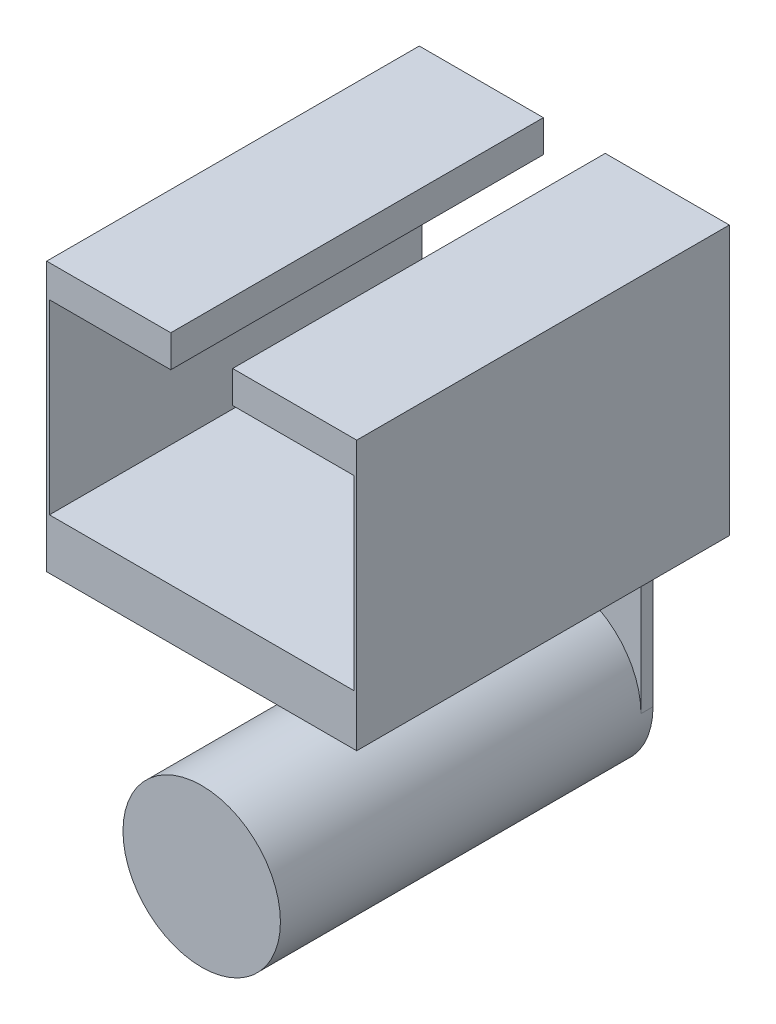
ISO-10303-21;
HEADER;
FILE_DESCRIPTION(('STEP AP214'),'2;1');
FILE_NAME('part.step','',(''),(''),'','','');
FILE_SCHEMA(('AUTOMOTIVE_DESIGN { 1 0 10303 214 1 1 1 1 }'));
ENDSEC;
DATA;
#1=APPLICATION_CONTEXT('core data for automotive mechanical design processes');
#2=APPLICATION_PROTOCOL_DEFINITION('international standard','automotive_design',2000,#1);
#3=PRODUCT_CONTEXT('',#1,'mechanical');
#4=PRODUCT('Part','Part','',(#3));
#5=PRODUCT_RELATED_PRODUCT_CATEGORY('part','',(#4));
#6=PRODUCT_DEFINITION_FORMATION('','',#4);
#7=PRODUCT_DEFINITION_CONTEXT('part definition',#1,'design');
#8=PRODUCT_DEFINITION('design','',#6,#7);
#9=PRODUCT_DEFINITION_SHAPE('','',#8);
#10=(LENGTH_UNIT() NAMED_UNIT(*) SI_UNIT(.MILLI.,.METRE.));
#11=(NAMED_UNIT(*) PLANE_ANGLE_UNIT() SI_UNIT($,.RADIAN.));
#12=(NAMED_UNIT(*) SI_UNIT($,.STERADIAN.) SOLID_ANGLE_UNIT());
#13=UNCERTAINTY_MEASURE_WITH_UNIT(LENGTH_MEASURE(1.E-05),#10,'distance_accuracy_value','');
#14=(GEOMETRIC_REPRESENTATION_CONTEXT(3) GLOBAL_UNCERTAINTY_ASSIGNED_CONTEXT((#13)) GLOBAL_UNIT_ASSIGNED_CONTEXT((#10,
#11,#12)) REPRESENTATION_CONTEXT('',''));
#15=CARTESIAN_POINT('',(0.,0.,0.));
#16=DIRECTION('',(0.,0.,1.));
#17=DIRECTION('',(1.,0.,0.));
#18=AXIS2_PLACEMENT_3D('',#15,#16,#17);
#19=CARTESIAN_POINT('',(0.,0.,2.4638));
#20=DIRECTION('',(1.,0.,0.));
#21=DIRECTION('',(0.,0.,-1.));
#22=AXIS2_PLACEMENT_3D('',#19,#20,#21);
#23=PLANE('',#22);
#24=DIRECTION('',(0.,-1.,0.));
#25=VECTOR('',#24,1.);
#26=CARTESIAN_POINT('',(0.,0.,0.));
#27=LINE('',#26,#25);
#28=CARTESIAN_POINT('',(0.,38.1,0.));
#29=VERTEX_POINT('',#28);
#30=CARTESIAN_POINT('',(0.,0.,0.));
#31=VERTEX_POINT('',#30);
#32=EDGE_CURVE('E299',#29,#31,#27,.T.);
#33=ORIENTED_EDGE('',*,*,#32,.T.);
#34=DIRECTION('',(0.,0.,-1.));
#35=VECTOR('',#34,1.);
#36=CARTESIAN_POINT('',(0.,0.,2.4638));
#37=LINE('',#36,#35);
#38=CARTESIAN_POINT('',(0.,0.,2.4638));
#39=VERTEX_POINT('',#38);
#40=EDGE_CURVE('E11',#39,#31,#37,.T.);
#41=ORIENTED_EDGE('',*,*,#40,.F.);
#42=DIRECTION('',(0.,-1.,0.));
#43=VECTOR('',#42,1.);
#44=CARTESIAN_POINT('',(0.,0.,2.4638));
#45=LINE('',#44,#43);
#46=CARTESIAN_POINT('',(0.,38.1,2.4638));
#47=VERTEX_POINT('',#46);
#48=EDGE_CURVE('E297',#47,#39,#45,.T.);
#49=ORIENTED_EDGE('',*,*,#48,.F.);
#50=DIRECTION('',(0.,0.,-1.));
#51=VECTOR('',#50,1.);
#52=CARTESIAN_POINT('',(0.,38.1,2.4638));
#53=LINE('',#52,#51);
#54=EDGE_CURVE('E311',#47,#29,#53,.T.);
#55=ORIENTED_EDGE('',*,*,#54,.T.);
#56=EDGE_LOOP('',(#33,#41,#49,#55));
#57=FACE_BOUND('',#56,.T.);
#58=ADVANCED_FACE('F44',(#57),#23,.F.);
#59=CARTESIAN_POINT('',(32.19958,0.,2.4638));
#60=DIRECTION('',(-1.,0.,0.));
#61=DIRECTION('',(0.,0.,1.));
#62=AXIS2_PLACEMENT_3D('',#59,#60,#61);
#63=PLANE('',#62);
#64=DIRECTION('',(0.,1.,0.));
#65=VECTOR('',#64,1.);
#66=CARTESIAN_POINT('',(32.19958,0.,0.));
#67=LINE('',#66,#65);
#68=CARTESIAN_POINT('',(32.19958,0.,0.));
#69=VERTEX_POINT('',#68);
#70=CARTESIAN_POINT('',(32.19958,38.1,0.));
#71=VERTEX_POINT('',#70);
#72=EDGE_CURVE('E304',#69,#71,#67,.T.);
#73=ORIENTED_EDGE('',*,*,#72,.T.);
#74=DIRECTION('',(0.,0.,-1.));
#75=VECTOR('',#74,1.);
#76=CARTESIAN_POINT('',(32.19958,38.1,2.4638));
#77=LINE('',#76,#75);
#78=CARTESIAN_POINT('',(32.19958,38.1,2.4638));
#79=VERTEX_POINT('',#78);
#80=EDGE_CURVE('E316',#79,#71,#77,.T.);
#81=ORIENTED_EDGE('',*,*,#80,.F.);
#82=DIRECTION('',(0.,1.,0.));
#83=VECTOR('',#82,1.);
#84=CARTESIAN_POINT('',(32.19958,0.,2.4638));
#85=LINE('',#84,#83);
#86=CARTESIAN_POINT('',(32.19958,0.,2.4638));
#87=VERTEX_POINT('',#86);
#88=EDGE_CURVE('E302',#87,#79,#85,.T.);
#89=ORIENTED_EDGE('',*,*,#88,.F.);
#90=DIRECTION('',(0.,0.,-1.));
#91=VECTOR('',#90,1.);
#92=CARTESIAN_POINT('',(32.19958,0.,2.4638));
#93=LINE('',#92,#91);
#94=EDGE_CURVE('E52',#87,#69,#93,.T.);
#95=ORIENTED_EDGE('',*,*,#94,.T.);
#96=EDGE_LOOP('',(#73,#81,#89,#95));
#97=FACE_BOUND('',#96,.T.);
#98=ADVANCED_FACE('F330',(#97),#63,.F.);
#99=CARTESIAN_POINT('',(0.,0.,2.4638));
#100=DIRECTION('',(0.,0.,-1.));
#101=DIRECTION('',(-1.,0.,0.));
#102=AXIS2_PLACEMENT_3D('',#99,#100,#101);
#103=PLANE('',#102);
#104=ORIENTED_EDGE('',*,*,#48,.T.);
#105=CARTESIAN_POINT('',(16.09979,0.,2.4638));
#106=DIRECTION('',(0.,0.,-1.));
#107=DIRECTION('',(-1.,0.,0.));
#108=AXIS2_PLACEMENT_3D('',#105,#106,#107);
#109=CIRCLE('',#108,16.09979);
#110=EDGE_CURVE('E292',#39,#87,#109,.T.);
#111=ORIENTED_EDGE('',*,*,#110,.T.);
#112=ORIENTED_EDGE('',*,*,#88,.T.);
#113=DIRECTION('',(-1.,0.,0.));
#114=VECTOR('',#113,1.);
#115=CARTESIAN_POINT('',(0.,38.1,2.4638));
#116=LINE('',#115,#114);
#117=EDGE_CURVE('E308',#79,#47,#116,.T.);
#118=ORIENTED_EDGE('',*,*,#117,.T.);
#119=EDGE_LOOP('',(#104,#111,#112,#118));
#120=FACE_BOUND('',#119,.T.);
#121=ADVANCED_FACE('F341',(#120),#103,.F.);
#122=CARTESIAN_POINT('',(0.,0.,0.));
#123=DIRECTION('',(0.,0.,-1.));
#124=DIRECTION('',(-1.,0.,0.));
#125=AXIS2_PLACEMENT_3D('',#122,#123,#124);
#126=PLANE('',#125);
#127=ORIENTED_EDGE('',*,*,#72,.F.);
#128=CARTESIAN_POINT('',(16.09979,0.,0.));
#129=DIRECTION('',(0.,0.,-1.));
#130=DIRECTION('',(-1.,0.,0.));
#131=AXIS2_PLACEMENT_3D('',#128,#129,#130);
#132=CIRCLE('',#131,16.09979);
#133=EDGE_CURVE('E289',#69,#31,#132,.T.);
#134=ORIENTED_EDGE('',*,*,#133,.T.);
#135=ORIENTED_EDGE('',*,*,#32,.F.);
#136=DIRECTION('',(-1.,0.,0.));
#137=VECTOR('',#136,1.);
#138=CARTESIAN_POINT('',(-15.60449,38.1,0.));
#139=LINE('',#138,#137);
#140=CARTESIAN_POINT('',(-15.60449,38.1,0.));
#141=VERTEX_POINT('',#140);
#142=EDGE_CURVE('E268',#29,#141,#139,.T.);
#143=ORIENTED_EDGE('',*,*,#142,.T.);
#144=DIRECTION('',(0.,-1.,0.));
#145=VECTOR('',#144,1.);
#146=CARTESIAN_POINT('',(-15.60449,48.4632,0.));
#147=LINE('',#146,#145);
#148=CARTESIAN_POINT('',(-15.60449,93.11894,0.));
#149=VERTEX_POINT('',#148);
#150=EDGE_CURVE('E257',#149,#141,#147,.T.);
#151=ORIENTED_EDGE('',*,*,#150,.F.);
#152=DIRECTION('',(-1.,0.,0.));
#153=VECTOR('',#152,1.);
#154=CARTESIAN_POINT('',(-15.60449,93.11894,0.));
#155=LINE('',#154,#153);
#156=CARTESIAN_POINT('',(9.77519,93.11894,0.));
#157=VERTEX_POINT('',#156);
#158=EDGE_CURVE('E210',#157,#149,#155,.T.);
#159=ORIENTED_EDGE('',*,*,#158,.F.);
#160=DIRECTION('',(0.,-1.,0.));
#161=VECTOR('',#160,1.);
#162=CARTESIAN_POINT('',(9.77519,93.11894,0.));
#163=LINE('',#162,#161);
#164=CARTESIAN_POINT('',(9.77519,86.5632,0.));
#165=VERTEX_POINT('',#164);
#166=EDGE_CURVE('E208',#157,#165,#163,.T.);
#167=ORIENTED_EDGE('',*,*,#166,.T.);
#168=DIRECTION('',(-1.,0.,0.));
#169=VECTOR('',#168,1.);
#170=CARTESIAN_POINT('',(-15.60449,86.5632,0.));
#171=LINE('',#170,#169);
#172=CARTESIAN_POINT('',(-15.04061,86.5632,0.));
#173=VERTEX_POINT('',#172);
#174=EDGE_CURVE('E202',#165,#173,#171,.T.);
#175=ORIENTED_EDGE('',*,*,#174,.T.);
#176=DIRECTION('',(0.,-1.,0.));
#177=VECTOR('',#176,1.);
#178=CARTESIAN_POINT('',(-15.04061,86.5632,0.));
#179=LINE('',#178,#177);
#180=CARTESIAN_POINT('',(-15.04061,48.4632,0.));
#181=VERTEX_POINT('',#180);
#182=EDGE_CURVE('E226',#173,#181,#179,.T.);
#183=ORIENTED_EDGE('',*,*,#182,.T.);
#184=DIRECTION('',(-1.,0.,0.));
#185=VECTOR('',#184,1.);
#186=CARTESIAN_POINT('',(-15.60449,48.4632,0.));
#187=LINE('',#186,#185);
#188=CARTESIAN_POINT('',(47.24019,48.4632,0.));
#189=VERTEX_POINT('',#188);
#190=EDGE_CURVE('E259',#189,#181,#187,.T.);
#191=ORIENTED_EDGE('',*,*,#190,.F.);
#192=DIRECTION('',(0.,-1.,0.));
#193=VECTOR('',#192,1.);
#194=CARTESIAN_POINT('',(47.24019,86.5632,0.));
#195=LINE('',#194,#193);
#196=CARTESIAN_POINT('',(47.24019,86.5632,0.));
#197=VERTEX_POINT('',#196);
#198=EDGE_CURVE('E245',#197,#189,#195,.T.);
#199=ORIENTED_EDGE('',*,*,#198,.F.);
#200=DIRECTION('',(-1.,0.,0.));
#201=VECTOR('',#200,1.);
#202=CARTESIAN_POINT('',(22.42439,86.5632,0.));
#203=LINE('',#202,#201);
#204=CARTESIAN_POINT('',(22.42439,86.5632,0.));
#205=VERTEX_POINT('',#204);
#206=EDGE_CURVE('E179',#197,#205,#203,.T.);
#207=ORIENTED_EDGE('',*,*,#206,.T.);
#208=DIRECTION('',(0.,-1.,0.));
#209=VECTOR('',#208,1.);
#210=CARTESIAN_POINT('',(22.42439,93.11894,0.));
#211=LINE('',#210,#209);
#212=CARTESIAN_POINT('',(22.42439,93.11894,0.));
#213=VERTEX_POINT('',#212);
#214=EDGE_CURVE('E190',#213,#205,#211,.T.);
#215=ORIENTED_EDGE('',*,*,#214,.F.);
#216=DIRECTION('',(-1.,0.,0.));
#217=VECTOR('',#216,1.);
#218=CARTESIAN_POINT('',(22.42439,93.11894,0.));
#219=LINE('',#218,#217);
#220=CARTESIAN_POINT('',(47.80407,93.11894,0.));
#221=VERTEX_POINT('',#220);
#222=EDGE_CURVE('E174',#221,#213,#219,.T.);
#223=ORIENTED_EDGE('',*,*,#222,.F.);
#224=DIRECTION('',(0.,-1.,0.));
#225=VECTOR('',#224,1.);
#226=CARTESIAN_POINT('',(47.80407,48.4632,0.));
#227=LINE('',#226,#225);
#228=CARTESIAN_POINT('',(47.80407,38.1,0.));
#229=VERTEX_POINT('',#228);
#230=EDGE_CURVE('E276',#221,#229,#227,.T.);
#231=ORIENTED_EDGE('',*,*,#230,.T.);
#232=EDGE_CURVE('E256',#229,#71,#139,.T.);
#233=ORIENTED_EDGE('',*,*,#232,.T.);
#234=EDGE_LOOP('',(#127,#134,#135,#143,#151,#159,#167,#175,#183,#191,#199,#207,#215,#223,#231,#233));
#235=FACE_BOUND('',#234,.T.);
#236=ADVANCED_FACE('F332',(#235),#126,.T.);
#237=CARTESIAN_POINT('',(16.09979,0.,76.2));
#238=DIRECTION('',(0.,0.,-1.));
#239=DIRECTION('',(-1.,0.,0.));
#240=AXIS2_PLACEMENT_3D('',#237,#238,#239);
#241=CYLINDRICAL_SURFACE('',#240,16.09979);
#242=CARTESIAN_POINT('',(16.09979,0.,76.2));
#243=DIRECTION('',(0.,0.,-1.));
#244=DIRECTION('',(-1.,0.,0.));
#245=AXIS2_PLACEMENT_3D('',#242,#243,#244);
#246=CIRCLE('',#245,16.09979);
#247=CARTESIAN_POINT('',(0.,0.,76.2));
#248=VERTEX_POINT('',#247);
#249=EDGE_CURVE('E290',#248,#248,#246,.T.);
#250=ORIENTED_EDGE('',*,*,#249,.T.);
#251=EDGE_LOOP('',(#250));
#252=FACE_BOUND('',#251,.T.);
#253=ORIENTED_EDGE('',*,*,#40,.T.);
#254=ORIENTED_EDGE('',*,*,#133,.F.);
#255=ORIENTED_EDGE('',*,*,#94,.F.);
#256=ORIENTED_EDGE('',*,*,#110,.F.);
#257=EDGE_LOOP('',(#253,#254,#255,#256));
#258=FACE_BOUND('',#257,.T.);
#259=ADVANCED_FACE('F342',(#252,#258),#241,.T.);
#260=CARTESIAN_POINT('',(16.09979,0.,76.2));
#261=DIRECTION('',(0.,0.,-1.));
#262=DIRECTION('',(-1.,0.,0.));
#263=AXIS2_PLACEMENT_3D('',#260,#261,#262);
#264=PLANE('',#263);
#265=ORIENTED_EDGE('',*,*,#249,.F.);
#266=EDGE_LOOP('',(#265));
#267=FACE_BOUND('',#266,.T.);
#268=ADVANCED_FACE('F350',(#267),#264,.F.);
#269=CARTESIAN_POINT('',(-15.60449,48.4632,0.));
#270=DIRECTION('',(1.,0.,0.));
#271=DIRECTION('',(0.,0.,-1.));
#272=AXIS2_PLACEMENT_3D('',#269,#270,#271);
#273=PLANE('',#272);
#274=DIRECTION('',(0.,0.,1.));
#275=VECTOR('',#274,1.);
#276=CARTESIAN_POINT('',(-15.60449,38.1,0.));
#277=LINE('',#276,#275);
#278=CARTESIAN_POINT('',(-15.60449,38.1,76.2));
#279=VERTEX_POINT('',#278);
#280=EDGE_CURVE('E255',#141,#279,#277,.T.);
#281=ORIENTED_EDGE('',*,*,#280,.T.);
#282=DIRECTION('',(0.,-1.,0.));
#283=VECTOR('',#282,1.);
#284=CARTESIAN_POINT('',(-15.60449,48.4632,76.2));
#285=LINE('',#284,#283);
#286=CARTESIAN_POINT('',(-15.60449,93.11894,76.2));
#287=VERTEX_POINT('',#286);
#288=EDGE_CURVE('E284',#287,#279,#285,.T.);
#289=ORIENTED_EDGE('',*,*,#288,.F.);
#290=DIRECTION('',(0.,0.,1.));
#291=VECTOR('',#290,1.);
#292=CARTESIAN_POINT('',(-15.60449,93.11894,0.));
#293=LINE('',#292,#291);
#294=EDGE_CURVE('E197',#149,#287,#293,.T.);
#295=ORIENTED_EDGE('',*,*,#294,.F.);
#296=ORIENTED_EDGE('',*,*,#150,.T.);
#297=EDGE_LOOP('',(#281,#289,#295,#296));
#298=FACE_BOUND('',#297,.T.);
#299=ADVANCED_FACE('F355',(#298),#273,.F.);
#300=CARTESIAN_POINT('',(-15.60449,48.4632,76.2));
#301=DIRECTION('',(0.,0.,-1.));
#302=DIRECTION('',(-1.,0.,0.));
#303=AXIS2_PLACEMENT_3D('',#300,#301,#302);
#304=PLANE('',#303);
#305=DIRECTION('',(1.,0.,0.));
#306=VECTOR('',#305,1.);
#307=CARTESIAN_POINT('',(-15.60449,38.1,76.2));
#308=LINE('',#307,#306);
#309=CARTESIAN_POINT('',(47.80407,38.1,76.2));
#310=VERTEX_POINT('',#309);
#311=EDGE_CURVE('E261',#279,#310,#308,.T.);
#312=ORIENTED_EDGE('',*,*,#311,.T.);
#313=DIRECTION('',(0.,-1.,0.));
#314=VECTOR('',#313,1.);
#315=CARTESIAN_POINT('',(47.80407,48.4632,76.2));
#316=LINE('',#315,#314);
#317=CARTESIAN_POINT('',(47.80407,93.11894,76.2));
#318=VERTEX_POINT('',#317);
#319=EDGE_CURVE('E165',#318,#310,#316,.T.);
#320=ORIENTED_EDGE('',*,*,#319,.F.);
#321=DIRECTION('',(1.,0.,0.));
#322=VECTOR('',#321,1.);
#323=CARTESIAN_POINT('',(22.42439,93.11894,76.2));
#324=LINE('',#323,#322);
#325=CARTESIAN_POINT('',(22.42439,93.11894,76.2));
#326=VERTEX_POINT('',#325);
#327=EDGE_CURVE('E157',#326,#318,#324,.T.);
#328=ORIENTED_EDGE('',*,*,#327,.F.);
#329=DIRECTION('',(0.,-1.,0.));
#330=VECTOR('',#329,1.);
#331=CARTESIAN_POINT('',(22.42439,93.11894,76.2));
#332=LINE('',#331,#330);
#333=CARTESIAN_POINT('',(22.42439,86.5632,76.2));
#334=VERTEX_POINT('',#333);
#335=EDGE_CURVE('E163',#326,#334,#332,.T.);
#336=ORIENTED_EDGE('',*,*,#335,.T.);
#337=DIRECTION('',(1.,0.,0.));
#338=VECTOR('',#337,1.);
#339=CARTESIAN_POINT('',(22.42439,86.5632,76.2));
#340=LINE('',#339,#338);
#341=CARTESIAN_POINT('',(47.24019,86.5632,76.2));
#342=VERTEX_POINT('',#341);
#343=EDGE_CURVE('E561',#334,#342,#340,.T.);
#344=ORIENTED_EDGE('',*,*,#343,.T.);
#345=DIRECTION('',(0.,-1.,0.));
#346=VECTOR('',#345,1.);
#347=CARTESIAN_POINT('',(47.24019,86.5632,76.2));
#348=LINE('',#347,#346);
#349=CARTESIAN_POINT('',(47.24019,48.4632,76.2));
#350=VERTEX_POINT('',#349);
#351=EDGE_CURVE('E247',#342,#350,#348,.T.);
#352=ORIENTED_EDGE('',*,*,#351,.T.);
#353=DIRECTION('',(1.,0.,0.));
#354=VECTOR('',#353,1.);
#355=CARTESIAN_POINT('',(-15.60449,48.4632,76.2));
#356=LINE('',#355,#354);
#357=CARTESIAN_POINT('',(-15.04061,48.4632,76.2));
#358=VERTEX_POINT('',#357);
#359=EDGE_CURVE('E254',#358,#350,#356,.T.);
#360=ORIENTED_EDGE('',*,*,#359,.F.);
#361=DIRECTION('',(0.,-1.,0.));
#362=VECTOR('',#361,1.);
#363=CARTESIAN_POINT('',(-15.04061,86.5632,76.2));
#364=LINE('',#363,#362);
#365=CARTESIAN_POINT('',(-15.04061,86.5632,76.2));
#366=VERTEX_POINT('',#365);
#367=EDGE_CURVE('E234',#366,#358,#364,.T.);
#368=ORIENTED_EDGE('',*,*,#367,.F.);
#369=DIRECTION('',(1.,0.,0.));
#370=VECTOR('',#369,1.);
#371=CARTESIAN_POINT('',(-15.60449,86.5632,76.2));
#372=LINE('',#371,#370);
#373=CARTESIAN_POINT('',(9.77519000000002,86.5632,76.2));
#374=VERTEX_POINT('',#373);
#375=EDGE_CURVE('E187',#366,#374,#372,.T.);
#376=ORIENTED_EDGE('',*,*,#375,.T.);
#377=DIRECTION('',(0.,-1.,0.));
#378=VECTOR('',#377,1.);
#379=CARTESIAN_POINT('',(9.77519000000002,93.11894,76.2));
#380=LINE('',#379,#378);
#381=CARTESIAN_POINT('',(9.77519000000002,93.11894,76.2));
#382=VERTEX_POINT('',#381);
#383=EDGE_CURVE('E218',#382,#374,#380,.T.);
#384=ORIENTED_EDGE('',*,*,#383,.F.);
#385=DIRECTION('',(1.,0.,0.));
#386=VECTOR('',#385,1.);
#387=CARTESIAN_POINT('',(-15.60449,93.11894,76.2));
#388=LINE('',#387,#386);
#389=EDGE_CURVE('E198',#287,#382,#388,.T.);
#390=ORIENTED_EDGE('',*,*,#389,.F.);
#391=ORIENTED_EDGE('',*,*,#288,.T.);
#392=EDGE_LOOP('',(#312,#320,#328,#336,#344,#352,#360,#368,#376,#384,#390,#391));
#393=FACE_BOUND('',#392,.T.);
#394=ADVANCED_FACE('F160',(#393),#304,.F.);
#395=CARTESIAN_POINT('',(47.80407,48.4632,0.));
#396=DIRECTION('',(-1.,0.,0.));
#397=DIRECTION('',(0.,0.,1.));
#398=AXIS2_PLACEMENT_3D('',#395,#396,#397);
#399=PLANE('',#398);
#400=DIRECTION('',(0.,0.,-1.));
#401=VECTOR('',#400,1.);
#402=CARTESIAN_POINT('',(47.80407,38.1,0.));
#403=LINE('',#402,#401);
#404=EDGE_CURVE('E269',#310,#229,#403,.T.);
#405=ORIENTED_EDGE('',*,*,#404,.T.);
#406=ORIENTED_EDGE('',*,*,#230,.F.);
#407=DIRECTION('',(0.,0.,-1.));
#408=VECTOR('',#407,1.);
#409=CARTESIAN_POINT('',(47.80407,93.11894,0.));
#410=LINE('',#409,#408);
#411=EDGE_CURVE('E169',#318,#221,#410,.T.);
#412=ORIENTED_EDGE('',*,*,#411,.F.);
#413=ORIENTED_EDGE('',*,*,#319,.T.);
#414=EDGE_LOOP('',(#405,#406,#412,#413));
#415=FACE_BOUND('',#414,.T.);
#416=ADVANCED_FACE('F389',(#415),#399,.F.);
#417=CARTESIAN_POINT('',(0.,48.4632,0.));
#418=DIRECTION('',(0.,1.,0.));
#419=DIRECTION('',(0.,0.,1.));
#420=AXIS2_PLACEMENT_3D('',#417,#418,#419);
#421=PLANE('',#420);
#422=DIRECTION('',(0.,0.,-1.));
#423=VECTOR('',#422,1.);
#424=CARTESIAN_POINT('',(-15.04061,48.4632,0.));
#425=LINE('',#424,#423);
#426=EDGE_CURVE('E58',#358,#181,#425,.T.);
#427=ORIENTED_EDGE('',*,*,#426,.F.);
#428=ORIENTED_EDGE('',*,*,#359,.T.);
#429=DIRECTION('',(0.,0.,1.));
#430=VECTOR('',#429,1.);
#431=CARTESIAN_POINT('',(47.24019,48.4632,0.));
#432=LINE('',#431,#430);
#433=EDGE_CURVE('E62',#189,#350,#432,.T.);
#434=ORIENTED_EDGE('',*,*,#433,.F.);
#435=ORIENTED_EDGE('',*,*,#190,.T.);
#436=EDGE_LOOP('',(#427,#428,#434,#435));
#437=FACE_BOUND('',#436,.T.);
#438=ADVANCED_FACE('F380',(#437),#421,.T.);
#439=CARTESIAN_POINT('',(0.,38.1,0.));
#440=DIRECTION('',(0.,1.,0.));
#441=DIRECTION('',(0.,0.,1.));
#442=AXIS2_PLACEMENT_3D('',#439,#440,#441);
#443=PLANE('',#442);
#444=ORIENTED_EDGE('',*,*,#54,.F.);
#445=ORIENTED_EDGE('',*,*,#117,.F.);
#446=ORIENTED_EDGE('',*,*,#80,.T.);
#447=ORIENTED_EDGE('',*,*,#232,.F.);
#448=ORIENTED_EDGE('',*,*,#404,.F.);
#449=ORIENTED_EDGE('',*,*,#311,.F.);
#450=ORIENTED_EDGE('',*,*,#280,.F.);
#451=ORIENTED_EDGE('',*,*,#142,.F.);
#452=EDGE_LOOP('',(#444,#445,#446,#447,#448,#449,#450,#451));
#453=FACE_BOUND('',#452,.T.);
#454=ADVANCED_FACE('F340',(#453),#443,.F.);
#455=CARTESIAN_POINT('',(47.24019,86.5632,0.));
#456=DIRECTION('',(1.,0.,0.));
#457=DIRECTION('',(0.,0.,-1.));
#458=AXIS2_PLACEMENT_3D('',#455,#456,#457);
#459=PLANE('',#458);
#460=ORIENTED_EDGE('',*,*,#433,.T.);
#461=ORIENTED_EDGE('',*,*,#351,.F.);
#462=DIRECTION('',(0.,0.,1.));
#463=VECTOR('',#462,1.);
#464=CARTESIAN_POINT('',(47.24019,86.5632,0.));
#465=LINE('',#464,#463);
#466=EDGE_CURVE('E238',#197,#342,#465,.T.);
#467=ORIENTED_EDGE('',*,*,#466,.F.);
#468=ORIENTED_EDGE('',*,*,#198,.T.);
#469=EDGE_LOOP('',(#460,#461,#467,#468));
#470=FACE_BOUND('',#469,.T.);
#471=ADVANCED_FACE('F376',(#470),#459,.F.);
#472=CARTESIAN_POINT('',(-15.04061,86.5632,0.));
#473=DIRECTION('',(-1.,0.,0.));
#474=DIRECTION('',(0.,0.,1.));
#475=AXIS2_PLACEMENT_3D('',#472,#473,#474);
#476=PLANE('',#475);
#477=ORIENTED_EDGE('',*,*,#426,.T.);
#478=ORIENTED_EDGE('',*,*,#182,.F.);
#479=DIRECTION('',(0.,0.,-1.));
#480=VECTOR('',#479,1.);
#481=CARTESIAN_POINT('',(-15.04061,86.5632,0.));
#482=LINE('',#481,#480);
#483=EDGE_CURVE('E221',#366,#173,#482,.T.);
#484=ORIENTED_EDGE('',*,*,#483,.F.);
#485=ORIENTED_EDGE('',*,*,#367,.T.);
#486=EDGE_LOOP('',(#477,#478,#484,#485));
#487=FACE_BOUND('',#486,.T.);
#488=ADVANCED_FACE('F405',(#487),#476,.F.);
#489=CARTESIAN_POINT('',(0.,86.5632,0.));
#490=DIRECTION('',(0.,1.,0.));
#491=DIRECTION('',(0.,0.,1.));
#492=AXIS2_PLACEMENT_3D('',#489,#490,#491);
#493=PLANE('',#492);
#494=ORIENTED_EDGE('',*,*,#375,.F.);
#495=ORIENTED_EDGE('',*,*,#483,.T.);
#496=ORIENTED_EDGE('',*,*,#174,.F.);
#497=DIRECTION('',(0.,0.,-1.));
#498=VECTOR('',#497,1.);
#499=CARTESIAN_POINT('',(9.77519,86.5632,0.));
#500=LINE('',#499,#498);
#501=EDGE_CURVE('E194',#374,#165,#500,.T.);
#502=ORIENTED_EDGE('',*,*,#501,.F.);
#503=EDGE_LOOP('',(#494,#495,#496,#502));
#504=FACE_BOUND('',#503,.T.);
#505=ADVANCED_FACE('F409',(#504),#493,.F.);
#506=CARTESIAN_POINT('',(9.77519,93.11894,0.));
#507=DIRECTION('',(-1.,0.,0.));
#508=DIRECTION('',(0.,0.,1.));
#509=AXIS2_PLACEMENT_3D('',#506,#507,#508);
#510=PLANE('',#509);
#511=ORIENTED_EDGE('',*,*,#501,.T.);
#512=ORIENTED_EDGE('',*,*,#166,.F.);
#513=DIRECTION('',(0.,0.,-1.));
#514=VECTOR('',#513,1.);
#515=CARTESIAN_POINT('',(9.77519,93.11894,0.));
#516=LINE('',#515,#514);
#517=EDGE_CURVE('E201',#382,#157,#516,.T.);
#518=ORIENTED_EDGE('',*,*,#517,.F.);
#519=ORIENTED_EDGE('',*,*,#383,.T.);
#520=EDGE_LOOP('',(#511,#512,#518,#519));
#521=FACE_BOUND('',#520,.T.);
#522=ADVANCED_FACE('F417',(#521),#510,.F.);
#523=CARTESIAN_POINT('',(0.,93.11894,0.));
#524=DIRECTION('',(0.,1.,0.));
#525=DIRECTION('',(0.,0.,1.));
#526=AXIS2_PLACEMENT_3D('',#523,#524,#525);
#527=PLANE('',#526);
#528=ORIENTED_EDGE('',*,*,#294,.T.);
#529=ORIENTED_EDGE('',*,*,#389,.T.);
#530=ORIENTED_EDGE('',*,*,#517,.T.);
#531=ORIENTED_EDGE('',*,*,#158,.T.);
#532=EDGE_LOOP('',(#528,#529,#530,#531));
#533=FACE_BOUND('',#532,.T.);
#534=ADVANCED_FACE('F424',(#533),#527,.T.);
#535=CARTESIAN_POINT('',(0.,86.5632,0.));
#536=DIRECTION('',(0.,1.,0.));
#537=DIRECTION('',(0.,0.,1.));
#538=AXIS2_PLACEMENT_3D('',#535,#536,#537);
#539=PLANE('',#538);
#540=ORIENTED_EDGE('',*,*,#206,.F.);
#541=ORIENTED_EDGE('',*,*,#466,.T.);
#542=ORIENTED_EDGE('',*,*,#343,.F.);
#543=DIRECTION('',(0.,0.,1.));
#544=VECTOR('',#543,1.);
#545=CARTESIAN_POINT('',(22.42439,86.5632,0.));
#546=LINE('',#545,#544);
#547=EDGE_CURVE('E183',#205,#334,#546,.T.);
#548=ORIENTED_EDGE('',*,*,#547,.F.);
#549=EDGE_LOOP('',(#540,#541,#542,#548));
#550=FACE_BOUND('',#549,.T.);
#551=ADVANCED_FACE('F433',(#550),#539,.F.);
#552=CARTESIAN_POINT('',(22.42439,93.11894,0.));
#553=DIRECTION('',(1.,0.,0.));
#554=DIRECTION('',(0.,0.,-1.));
#555=AXIS2_PLACEMENT_3D('',#552,#553,#554);
#556=PLANE('',#555);
#557=ORIENTED_EDGE('',*,*,#547,.T.);
#558=ORIENTED_EDGE('',*,*,#335,.F.);
#559=DIRECTION('',(0.,0.,1.));
#560=VECTOR('',#559,1.);
#561=CARTESIAN_POINT('',(22.42439,93.11894,0.));
#562=LINE('',#561,#560);
#563=EDGE_CURVE('E167',#213,#326,#562,.T.);
#564=ORIENTED_EDGE('',*,*,#563,.F.);
#565=ORIENTED_EDGE('',*,*,#214,.T.);
#566=EDGE_LOOP('',(#557,#558,#564,#565));
#567=FACE_BOUND('',#566,.T.);
#568=ADVANCED_FACE('F185',(#567),#556,.F.);
#569=CARTESIAN_POINT('',(0.,93.11894,0.));
#570=DIRECTION('',(0.,1.,0.));
#571=DIRECTION('',(0.,0.,1.));
#572=AXIS2_PLACEMENT_3D('',#569,#570,#571);
#573=PLANE('',#572);
#574=ORIENTED_EDGE('',*,*,#563,.T.);
#575=ORIENTED_EDGE('',*,*,#327,.T.);
#576=ORIENTED_EDGE('',*,*,#411,.T.);
#577=ORIENTED_EDGE('',*,*,#222,.T.);
#578=EDGE_LOOP('',(#574,#575,#576,#577));
#579=FACE_BOUND('',#578,.T.);
#580=ADVANCED_FACE('F173',(#579),#573,.T.);
#581=CLOSED_SHELL('',(#58,#98,#121,#236,#259,#268,#299,#394,#416,#438,#454,#471,#488,#505,#522,
#534,#551,#568,#580));
#582=MANIFOLD_SOLID_BREP('B2',#581);
#583=ADVANCED_BREP_SHAPE_REPRESENTATION('',(#18,#582),#14);
#584=SHAPE_DEFINITION_REPRESENTATION(#9,#583);
ENDSEC;
END-ISO-10303-21;
